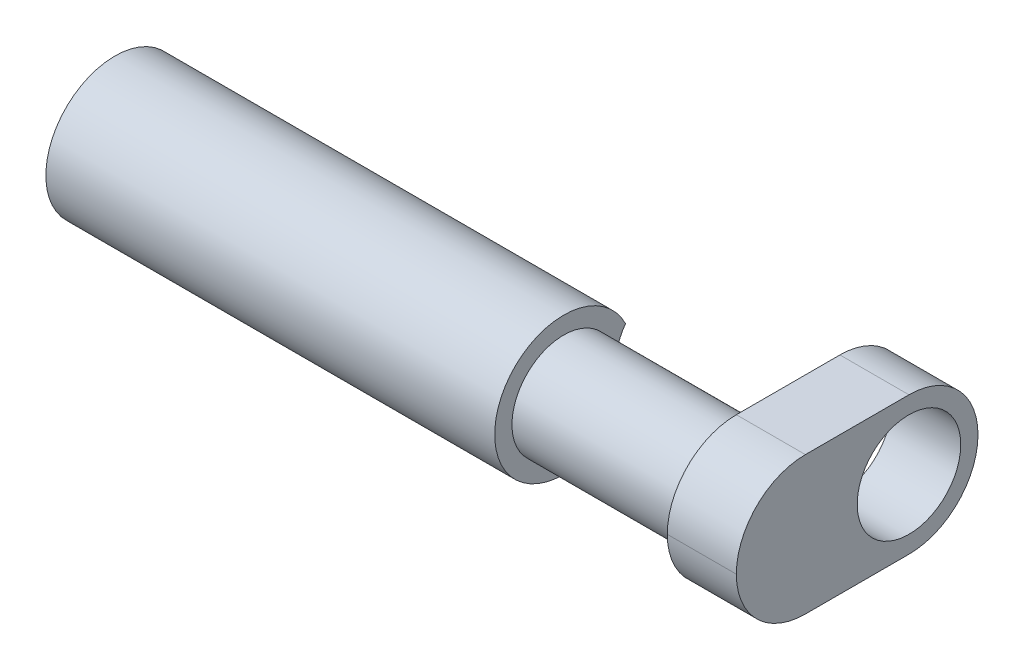
ISO-10303-21;
HEADER;
FILE_DESCRIPTION(('STEP AP214'),'2;1');
FILE_NAME('part.step','',(''),(''),'','','');
FILE_SCHEMA(('AUTOMOTIVE_DESIGN { 1 0 10303 214 1 1 1 1 }'));
ENDSEC;
DATA;
#1=APPLICATION_CONTEXT('core data for automotive mechanical design processes');
#2=APPLICATION_PROTOCOL_DEFINITION('international standard','automotive_design',2000,#1);
#3=PRODUCT_CONTEXT('',#1,'mechanical');
#4=PRODUCT('Part','Part','',(#3));
#5=PRODUCT_RELATED_PRODUCT_CATEGORY('part','',(#4));
#6=PRODUCT_DEFINITION_FORMATION('','',#4);
#7=PRODUCT_DEFINITION_CONTEXT('part definition',#1,'design');
#8=PRODUCT_DEFINITION('design','',#6,#7);
#9=PRODUCT_DEFINITION_SHAPE('','',#8);
#10=(LENGTH_UNIT() NAMED_UNIT(*) SI_UNIT(.MILLI.,.METRE.));
#11=(NAMED_UNIT(*) PLANE_ANGLE_UNIT() SI_UNIT($,.RADIAN.));
#12=(NAMED_UNIT(*) SI_UNIT($,.STERADIAN.) SOLID_ANGLE_UNIT());
#13=UNCERTAINTY_MEASURE_WITH_UNIT(LENGTH_MEASURE(1.E-05),#10,'distance_accuracy_value','');
#14=(GEOMETRIC_REPRESENTATION_CONTEXT(3) GLOBAL_UNCERTAINTY_ASSIGNED_CONTEXT((#13)) GLOBAL_UNIT_ASSIGNED_CONTEXT((#10,
#11,#12)) REPRESENTATION_CONTEXT('',''));
#15=CARTESIAN_POINT('',(0.,0.,0.));
#16=DIRECTION('',(0.,0.,1.));
#17=DIRECTION('',(1.,0.,0.));
#18=AXIS2_PLACEMENT_3D('',#15,#16,#17);
#19=CARTESIAN_POINT('',(20.,0.,0.));
#20=DIRECTION('',(-1.,0.,0.));
#21=DIRECTION('',(0.,0.,1.));
#22=AXIS2_PLACEMENT_3D('',#19,#20,#21);
#23=CYLINDRICAL_SURFACE('',#22,1.5);
#24=CARTESIAN_POINT('',(18.,0.,0.));
#25=DIRECTION('',(1.,0.,0.));
#26=DIRECTION('',(0.,0.,-1.));
#27=AXIS2_PLACEMENT_3D('',#24,#25,#26);
#28=CIRCLE('',#27,1.5);
#29=CARTESIAN_POINT('',(18.,0.,-1.5));
#30=VERTEX_POINT('',#29);
#31=EDGE_CURVE('E127',#30,#30,#28,.T.);
#32=ORIENTED_EDGE('',*,*,#31,.F.);
#33=EDGE_LOOP('',(#32));
#34=FACE_BOUND('',#33,.T.);
#35=CARTESIAN_POINT('',(13.,0.,0.));
#36=DIRECTION('',(1.,0.,0.));
#37=DIRECTION('',(0.,0.,-1.));
#38=AXIS2_PLACEMENT_3D('',#35,#36,#37);
#39=CIRCLE('',#38,1.5);
#40=CARTESIAN_POINT('',(13.,0.,-1.5));
#41=VERTEX_POINT('',#40);
#42=EDGE_CURVE('E121',#41,#41,#39,.T.);
#43=ORIENTED_EDGE('',*,*,#42,.T.);
#44=EDGE_LOOP('',(#43));
#45=FACE_BOUND('',#44,.T.);
#46=ADVANCED_FACE('F33',(#34,#45),#23,.T.);
#47=CARTESIAN_POINT('',(13.,0.,0.));
#48=DIRECTION('',(-1.,0.,0.));
#49=DIRECTION('',(0.,0.,1.));
#50=AXIS2_PLACEMENT_3D('',#47,#48,#49);
#51=CYLINDRICAL_SURFACE('',#50,2.);
#52=CARTESIAN_POINT('',(0.,0.,0.));
#53=DIRECTION('',(1.,0.,0.));
#54=DIRECTION('',(0.,0.,-1.));
#55=AXIS2_PLACEMENT_3D('',#52,#53,#54);
#56=CIRCLE('',#55,2.);
#57=CARTESIAN_POINT('',(0.,0.888780375320895,-1.79166666666667));
#58=VERTEX_POINT('',#57);
#59=CARTESIAN_POINT('',(0.,-0.888780375320895,-1.79166666666667));
#60=VERTEX_POINT('',#59);
#61=EDGE_CURVE('E113',#58,#60,#56,.T.);
#62=ORIENTED_EDGE('',*,*,#61,.T.);
#63=DIRECTION('',(1.,0.,0.));
#64=VECTOR('',#63,1.);
#65=CARTESIAN_POINT('',(10.,-0.888780375320895,-1.79166666666667));
#66=LINE('',#65,#64);
#67=CARTESIAN_POINT('',(13.,-0.888780375320895,-1.79166666666667));
#68=VERTEX_POINT('',#67);
#69=EDGE_CURVE('E49',#60,#68,#66,.T.);
#70=ORIENTED_EDGE('',*,*,#69,.T.);
#71=CARTESIAN_POINT('',(13.,0.,0.));
#72=DIRECTION('',(1.,0.,0.));
#73=DIRECTION('',(0.,0.,-1.));
#74=AXIS2_PLACEMENT_3D('',#71,#72,#73);
#75=CIRCLE('',#74,2.);
#76=CARTESIAN_POINT('',(13.,0.888780375320895,-1.79166666666667));
#77=VERTEX_POINT('',#76);
#78=EDGE_CURVE('E115',#77,#68,#75,.T.);
#79=ORIENTED_EDGE('',*,*,#78,.F.);
#80=DIRECTION('',(1.,0.,0.));
#81=VECTOR('',#80,1.);
#82=CARTESIAN_POINT('',(10.,0.888780375320895,-1.79166666666667));
#83=LINE('',#82,#81);
#84=EDGE_CURVE('E103',#77,#58,#83,.F.);
#85=ORIENTED_EDGE('',*,*,#84,.T.);
#86=EDGE_LOOP('',(#62,#70,#79,#85));
#87=FACE_BOUND('',#86,.T.);
#88=ADVANCED_FACE('F112',(#87),#51,.T.);
#89=CARTESIAN_POINT('',(13.,0.,0.));
#90=DIRECTION('',(1.,0.,0.));
#91=DIRECTION('',(0.,0.,-1.));
#92=AXIS2_PLACEMENT_3D('',#89,#90,#91);
#93=PLANE('',#92);
#94=CARTESIAN_POINT('',(13.,0.,-3.));
#95=DIRECTION('',(1.,0.,0.));
#96=DIRECTION('',(0.,0.,-1.));
#97=AXIS2_PLACEMENT_3D('',#94,#95,#96);
#98=CIRCLE('',#97,1.5);
#99=EDGE_CURVE('E116',#77,#41,#98,.T.);
#100=ORIENTED_EDGE('',*,*,#99,.F.);
#101=ORIENTED_EDGE('',*,*,#78,.T.);
#102=EDGE_CURVE('E200',#41,#68,#98,.T.);
#103=ORIENTED_EDGE('',*,*,#102,.F.);
#104=ORIENTED_EDGE('',*,*,#42,.F.);
#105=EDGE_LOOP('',(#100,#101,#103,#104));
#106=FACE_BOUND('',#105,.T.);
#107=ADVANCED_FACE('F199',(#106),#93,.T.);
#108=CARTESIAN_POINT('',(0.,0.,0.));
#109=DIRECTION('',(1.,0.,0.));
#110=DIRECTION('',(0.,0.,-1.));
#111=AXIS2_PLACEMENT_3D('',#108,#109,#110);
#112=PLANE('',#111);
#113=ORIENTED_EDGE('',*,*,#61,.F.);
#114=CARTESIAN_POINT('',(0.,0.,-3.));
#115=DIRECTION('',(1.,0.,0.));
#116=DIRECTION('',(0.,0.,-1.));
#117=AXIS2_PLACEMENT_3D('',#114,#115,#116);
#118=CIRCLE('',#117,1.5);
#119=EDGE_CURVE('E100',#58,#60,#118,.T.);
#120=ORIENTED_EDGE('',*,*,#119,.T.);
#121=EDGE_LOOP('',(#113,#120));
#122=FACE_BOUND('',#121,.T.);
#123=ADVANCED_FACE('F118',(#122),#112,.F.);
#124=CARTESIAN_POINT('',(18.,2.,2.));
#125=DIRECTION('',(0.,1.,0.));
#126=DIRECTION('',(0.,0.,1.));
#127=AXIS2_PLACEMENT_3D('',#124,#125,#126);
#128=PLANE('',#127);
#129=DIRECTION('',(0.,0.,1.));
#130=VECTOR('',#129,1.);
#131=CARTESIAN_POINT('',(20.,2.,2.));
#132=LINE('',#131,#130);
#133=CARTESIAN_POINT('',(20.,2.,-3.));
#134=VERTEX_POINT('',#133);
#135=CARTESIAN_POINT('',(20.,2.,0.));
#136=VERTEX_POINT('',#135);
#137=EDGE_CURVE('E174',#134,#136,#132,.T.);
#138=ORIENTED_EDGE('',*,*,#137,.F.);
#139=DIRECTION('',(-1.,0.,0.));
#140=VECTOR('',#139,1.);
#141=CARTESIAN_POINT('',(18.,2.,-3.));
#142=LINE('',#141,#140);
#143=CARTESIAN_POINT('',(18.,2.,-3.));
#144=VERTEX_POINT('',#143);
#145=EDGE_CURVE('E11',#134,#144,#142,.T.);
#146=ORIENTED_EDGE('',*,*,#145,.T.);
#147=DIRECTION('',(0.,0.,1.));
#148=VECTOR('',#147,1.);
#149=CARTESIAN_POINT('',(18.,2.,2.));
#150=LINE('',#149,#148);
#151=CARTESIAN_POINT('',(18.,2.,0.));
#152=VERTEX_POINT('',#151);
#153=EDGE_CURVE('E119',#144,#152,#150,.T.);
#154=ORIENTED_EDGE('',*,*,#153,.T.);
#155=DIRECTION('',(1.,0.,0.));
#156=VECTOR('',#155,1.);
#157=CARTESIAN_POINT('',(18.,2.,0.));
#158=LINE('',#157,#156);
#159=EDGE_CURVE('E130',#152,#136,#158,.T.);
#160=ORIENTED_EDGE('',*,*,#159,.T.);
#161=EDGE_LOOP('',(#138,#146,#154,#160));
#162=FACE_BOUND('',#161,.T.);
#163=ADVANCED_FACE('F185',(#162),#128,.T.);
#164=CARTESIAN_POINT('',(18.,-2.,2.));
#165=DIRECTION('',(0.,-1.,0.));
#166=DIRECTION('',(0.,0.,-1.));
#167=AXIS2_PLACEMENT_3D('',#164,#165,#166);
#168=PLANE('',#167);
#169=DIRECTION('',(0.,0.,-1.));
#170=VECTOR('',#169,1.);
#171=CARTESIAN_POINT('',(18.,-2.,2.));
#172=LINE('',#171,#170);
#173=CARTESIAN_POINT('',(18.,-2.,0.));
#174=VERTEX_POINT('',#173);
#175=CARTESIAN_POINT('',(18.,-2.,-3.));
#176=VERTEX_POINT('',#175);
#177=EDGE_CURVE('E123',#174,#176,#172,.T.);
#178=ORIENTED_EDGE('',*,*,#177,.T.);
#179=DIRECTION('',(1.,0.,0.));
#180=VECTOR('',#179,1.);
#181=CARTESIAN_POINT('',(18.,-2.,-3.));
#182=LINE('',#181,#180);
#183=CARTESIAN_POINT('',(20.,-2.,-3.));
#184=VERTEX_POINT('',#183);
#185=EDGE_CURVE('E148',#176,#184,#182,.T.);
#186=ORIENTED_EDGE('',*,*,#185,.T.);
#187=DIRECTION('',(0.,0.,-1.));
#188=VECTOR('',#187,1.);
#189=CARTESIAN_POINT('',(20.,-2.,2.));
#190=LINE('',#189,#188);
#191=CARTESIAN_POINT('',(20.,-2.,0.));
#192=VERTEX_POINT('',#191);
#193=EDGE_CURVE('E181',#192,#184,#190,.T.);
#194=ORIENTED_EDGE('',*,*,#193,.F.);
#195=DIRECTION('',(1.,0.,0.));
#196=VECTOR('',#195,1.);
#197=CARTESIAN_POINT('',(18.,-2.,0.));
#198=LINE('',#197,#196);
#199=EDGE_CURVE('E144',#192,#174,#198,.F.);
#200=ORIENTED_EDGE('',*,*,#199,.T.);
#201=EDGE_LOOP('',(#178,#186,#194,#200));
#202=FACE_BOUND('',#201,.T.);
#203=ADVANCED_FACE('F170',(#202),#168,.T.);
#204=CARTESIAN_POINT('',(18.,0.,0.));
#205=DIRECTION('',(1.,0.,0.));
#206=DIRECTION('',(0.,0.,-1.));
#207=AXIS2_PLACEMENT_3D('',#204,#205,#206);
#208=PLANE('',#207);
#209=ORIENTED_EDGE('',*,*,#31,.T.);
#210=CARTESIAN_POINT('',(18.,0.,-3.));
#211=DIRECTION('',(1.,0.,0.));
#212=DIRECTION('',(0.,0.,-1.));
#213=AXIS2_PLACEMENT_3D('',#210,#211,#212);
#214=CIRCLE('',#213,1.5);
#215=EDGE_CURVE('E55',#30,#30,#214,.T.);
#216=ORIENTED_EDGE('',*,*,#215,.T.);
#217=EDGE_LOOP('',(#209,#216));
#218=FACE_BOUND('',#217,.T.);
#219=CARTESIAN_POINT('',(18.,0.,-3.));
#220=DIRECTION('',(1.,0.,0.));
#221=DIRECTION('',(0.,0.,-1.));
#222=AXIS2_PLACEMENT_3D('',#219,#220,#221);
#223=CIRCLE('',#222,2.);
#224=CARTESIAN_POINT('',(18.,0.,-5.));
#225=VERTEX_POINT('',#224);
#226=EDGE_CURVE('E155',#144,#225,#223,.F.);
#227=ORIENTED_EDGE('',*,*,#226,.T.);
#228=CARTESIAN_POINT('',(18.,0.,-3.));
#229=DIRECTION('',(1.,0.,0.));
#230=DIRECTION('',(0.,0.,-1.));
#231=AXIS2_PLACEMENT_3D('',#228,#229,#230);
#232=CIRCLE('',#231,2.);
#233=EDGE_CURVE('E42',#225,#176,#232,.F.);
#234=ORIENTED_EDGE('',*,*,#233,.T.);
#235=ORIENTED_EDGE('',*,*,#177,.F.);
#236=CARTESIAN_POINT('',(18.,0.,0.));
#237=DIRECTION('',(1.,0.,0.));
#238=DIRECTION('',(0.,0.,-1.));
#239=AXIS2_PLACEMENT_3D('',#236,#237,#238);
#240=CIRCLE('',#239,2.);
#241=CARTESIAN_POINT('',(18.,0.,2.));
#242=VERTEX_POINT('',#241);
#243=EDGE_CURVE('E146',#174,#242,#240,.F.);
#244=ORIENTED_EDGE('',*,*,#243,.T.);
#245=CARTESIAN_POINT('',(18.,0.,0.));
#246=DIRECTION('',(1.,0.,0.));
#247=DIRECTION('',(0.,0.,-1.));
#248=AXIS2_PLACEMENT_3D('',#245,#246,#247);
#249=CIRCLE('',#248,2.);
#250=EDGE_CURVE('E139',#242,#152,#249,.F.);
#251=ORIENTED_EDGE('',*,*,#250,.T.);
#252=ORIENTED_EDGE('',*,*,#153,.F.);
#253=EDGE_LOOP('',(#227,#234,#235,#244,#251,#252));
#254=FACE_BOUND('',#253,.T.);
#255=ADVANCED_FACE('F161',(#218,#254),#208,.F.);
#256=CARTESIAN_POINT('',(20.,0.,0.));
#257=DIRECTION('',(1.,0.,0.));
#258=DIRECTION('',(0.,0.,-1.));
#259=AXIS2_PLACEMENT_3D('',#256,#257,#258);
#260=PLANE('',#259);
#261=CARTESIAN_POINT('',(20.,0.,-3.));
#262=DIRECTION('',(1.,0.,0.));
#263=DIRECTION('',(0.,0.,-1.));
#264=AXIS2_PLACEMENT_3D('',#261,#262,#263);
#265=CIRCLE('',#264,1.5);
#266=CARTESIAN_POINT('',(20.,0.,-4.5));
#267=VERTEX_POINT('',#266);
#268=EDGE_CURVE('E108',#267,#267,#265,.T.);
#269=ORIENTED_EDGE('',*,*,#268,.F.);
#270=EDGE_LOOP('',(#269));
#271=FACE_BOUND('',#270,.T.);
#272=ORIENTED_EDGE('',*,*,#193,.T.);
#273=CARTESIAN_POINT('',(20.,0.,-3.));
#274=DIRECTION('',(1.,0.,0.));
#275=DIRECTION('',(0.,0.,-1.));
#276=AXIS2_PLACEMENT_3D('',#273,#274,#275);
#277=CIRCLE('',#276,2.);
#278=CARTESIAN_POINT('',(20.,0.,-5.));
#279=VERTEX_POINT('',#278);
#280=EDGE_CURVE('E153',#184,#279,#277,.T.);
#281=ORIENTED_EDGE('',*,*,#280,.T.);
#282=CARTESIAN_POINT('',(20.,0.,-3.));
#283=DIRECTION('',(1.,0.,0.));
#284=DIRECTION('',(0.,0.,-1.));
#285=AXIS2_PLACEMENT_3D('',#282,#283,#284);
#286=CIRCLE('',#285,2.);
#287=EDGE_CURVE('E151',#279,#134,#286,.T.);
#288=ORIENTED_EDGE('',*,*,#287,.T.);
#289=ORIENTED_EDGE('',*,*,#137,.T.);
#290=CARTESIAN_POINT('',(20.,0.,0.));
#291=DIRECTION('',(1.,0.,0.));
#292=DIRECTION('',(0.,0.,-1.));
#293=AXIS2_PLACEMENT_3D('',#290,#291,#292);
#294=CIRCLE('',#293,2.);
#295=CARTESIAN_POINT('',(20.,0.,2.));
#296=VERTEX_POINT('',#295);
#297=EDGE_CURVE('E133',#136,#296,#294,.T.);
#298=ORIENTED_EDGE('',*,*,#297,.T.);
#299=CARTESIAN_POINT('',(20.,0.,0.));
#300=DIRECTION('',(1.,0.,0.));
#301=DIRECTION('',(0.,0.,-1.));
#302=AXIS2_PLACEMENT_3D('',#299,#300,#301);
#303=CIRCLE('',#302,2.);
#304=EDGE_CURVE('E142',#296,#192,#303,.T.);
#305=ORIENTED_EDGE('',*,*,#304,.T.);
#306=EDGE_LOOP('',(#272,#281,#288,#289,#298,#305));
#307=FACE_BOUND('',#306,.T.);
#308=ADVANCED_FACE('F179',(#271,#307),#260,.T.);
#309=CARTESIAN_POINT('',(18.,0.,0.));
#310=DIRECTION('',(1.,0.,0.));
#311=DIRECTION('',(0.,0.,-1.));
#312=AXIS2_PLACEMENT_3D('',#309,#310,#311);
#313=CYLINDRICAL_SURFACE('',#312,2.);
#314=ORIENTED_EDGE('',*,*,#250,.F.);
#315=DIRECTION('',(1.,0.,0.));
#316=VECTOR('',#315,1.);
#317=CARTESIAN_POINT('',(18.,0.,2.));
#318=LINE('',#317,#316);
#319=EDGE_CURVE('E136',#296,#242,#318,.F.);
#320=ORIENTED_EDGE('',*,*,#319,.F.);
#321=ORIENTED_EDGE('',*,*,#297,.F.);
#322=ORIENTED_EDGE('',*,*,#159,.F.);
#323=EDGE_LOOP('',(#314,#320,#321,#322));
#324=FACE_BOUND('',#323,.T.);
#325=ADVANCED_FACE('F191',(#324),#313,.T.);
#326=CARTESIAN_POINT('',(18.,0.,0.));
#327=DIRECTION('',(1.,0.,0.));
#328=DIRECTION('',(0.,0.,-1.));
#329=AXIS2_PLACEMENT_3D('',#326,#327,#328);
#330=CYLINDRICAL_SURFACE('',#329,2.);
#331=ORIENTED_EDGE('',*,*,#243,.F.);
#332=ORIENTED_EDGE('',*,*,#199,.F.);
#333=ORIENTED_EDGE('',*,*,#304,.F.);
#334=ORIENTED_EDGE('',*,*,#319,.T.);
#335=EDGE_LOOP('',(#331,#332,#333,#334));
#336=FACE_BOUND('',#335,.T.);
#337=ADVANCED_FACE('F216',(#336),#330,.T.);
#338=CARTESIAN_POINT('',(18.,0.,-3.));
#339=DIRECTION('',(-1.,0.,0.));
#340=DIRECTION('',(0.,0.,1.));
#341=AXIS2_PLACEMENT_3D('',#338,#339,#340);
#342=CYLINDRICAL_SURFACE('',#341,2.);
#343=DIRECTION('',(-1.,0.,0.));
#344=VECTOR('',#343,1.);
#345=CARTESIAN_POINT('',(0.,0.,-5.));
#346=LINE('',#345,#344);
#347=EDGE_CURVE('E37',#225,#279,#346,.F.);
#348=ORIENTED_EDGE('',*,*,#347,.F.);
#349=ORIENTED_EDGE('',*,*,#226,.F.);
#350=ORIENTED_EDGE('',*,*,#145,.F.);
#351=ORIENTED_EDGE('',*,*,#287,.F.);
#352=EDGE_LOOP('',(#348,#349,#350,#351));
#353=FACE_BOUND('',#352,.T.);
#354=ADVANCED_FACE('F35',(#353),#342,.T.);
#355=CARTESIAN_POINT('',(18.,0.,-3.));
#356=DIRECTION('',(1.,0.,0.));
#357=DIRECTION('',(0.,0.,-1.));
#358=AXIS2_PLACEMENT_3D('',#355,#356,#357);
#359=CYLINDRICAL_SURFACE('',#358,2.);
#360=ORIENTED_EDGE('',*,*,#233,.F.);
#361=ORIENTED_EDGE('',*,*,#347,.T.);
#362=ORIENTED_EDGE('',*,*,#280,.F.);
#363=ORIENTED_EDGE('',*,*,#185,.F.);
#364=EDGE_LOOP('',(#360,#361,#362,#363));
#365=FACE_BOUND('',#364,.T.);
#366=ADVANCED_FACE('F176',(#365),#359,.T.);
#367=CARTESIAN_POINT('',(0.,0.,-3.));
#368=DIRECTION('',(1.,0.,0.));
#369=DIRECTION('',(0.,0.,-1.));
#370=AXIS2_PLACEMENT_3D('',#367,#368,#369);
#371=CYLINDRICAL_SURFACE('',#370,1.5);
#372=ORIENTED_EDGE('',*,*,#268,.T.);
#373=EDGE_LOOP('',(#372));
#374=FACE_BOUND('',#373,.T.);
#375=ORIENTED_EDGE('',*,*,#215,.F.);
#376=EDGE_LOOP('',(#375));
#377=FACE_BOUND('',#376,.T.);
#378=ADVANCED_FACE('F208',(#374,#377),#371,.F.);
#379=ORIENTED_EDGE('',*,*,#99,.T.);
#380=ORIENTED_EDGE('',*,*,#102,.T.);
#381=ORIENTED_EDGE('',*,*,#69,.F.);
#382=ORIENTED_EDGE('',*,*,#119,.F.);
#383=ORIENTED_EDGE('',*,*,#84,.F.);
#384=EDGE_LOOP('',(#379,#380,#381,#382,#383));
#385=FACE_BOUND('',#384,.T.);
#386=ADVANCED_FACE('F102',(#385),#371,.F.);
#387=CLOSED_SHELL('',(#46,#88,#107,#123,#163,#203,#255,#308,#325,#337,#354,#366,#378,#386));
#388=MANIFOLD_SOLID_BREP('B2',#387);
#389=ADVANCED_BREP_SHAPE_REPRESENTATION('',(#18,#388),#14);
#390=SHAPE_DEFINITION_REPRESENTATION(#9,#389);
ENDSEC;
END-ISO-10303-21;
